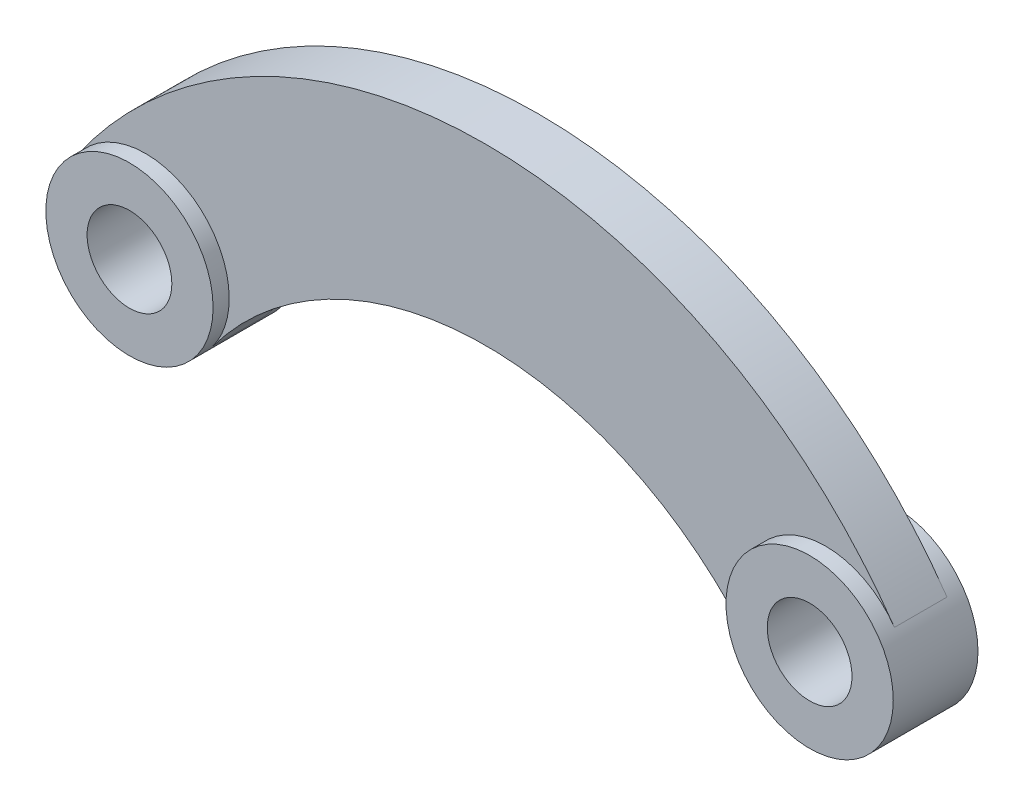
ISO-10303-21;
HEADER;
FILE_DESCRIPTION(('STEP AP214'),'2;1');
FILE_NAME('part.step','',(''),(''),'','','');
FILE_SCHEMA(('AUTOMOTIVE_DESIGN { 1 0 10303 214 1 1 1 1 }'));
ENDSEC;
DATA;
#1=APPLICATION_CONTEXT('core data for automotive mechanical design processes');
#2=APPLICATION_PROTOCOL_DEFINITION('international standard','automotive_design',2000,#1);
#3=PRODUCT_CONTEXT('',#1,'mechanical');
#4=PRODUCT('Part','Part','',(#3));
#5=PRODUCT_RELATED_PRODUCT_CATEGORY('part','',(#4));
#6=PRODUCT_DEFINITION_FORMATION('','',#4);
#7=PRODUCT_DEFINITION_CONTEXT('part definition',#1,'design');
#8=PRODUCT_DEFINITION('design','',#6,#7);
#9=PRODUCT_DEFINITION_SHAPE('','',#8);
#10=(LENGTH_UNIT() NAMED_UNIT(*) SI_UNIT(.MILLI.,.METRE.));
#11=(NAMED_UNIT(*) PLANE_ANGLE_UNIT() SI_UNIT($,.RADIAN.));
#12=(NAMED_UNIT(*) SI_UNIT($,.STERADIAN.) SOLID_ANGLE_UNIT());
#13=UNCERTAINTY_MEASURE_WITH_UNIT(LENGTH_MEASURE(1.E-05),#10,'distance_accuracy_value','');
#14=(GEOMETRIC_REPRESENTATION_CONTEXT(3) GLOBAL_UNCERTAINTY_ASSIGNED_CONTEXT((#13)) GLOBAL_UNIT_ASSIGNED_CONTEXT((#10,
#11,#12)) REPRESENTATION_CONTEXT('',''));
#15=CARTESIAN_POINT('',(0.,0.,0.));
#16=DIRECTION('',(0.,0.,1.));
#17=DIRECTION('',(1.,0.,0.));
#18=AXIS2_PLACEMENT_3D('',#15,#16,#17);
#19=CARTESIAN_POINT('',(0.,0.,-38.));
#20=DIRECTION('',(0.,0.,1.));
#21=DIRECTION('',(1.,0.,0.));
#22=AXIS2_PLACEMENT_3D('',#19,#20,#21);
#23=CYLINDRICAL_SURFACE('',#22,75.);
#24=CARTESIAN_POINT('',(0.,0.,23.5743715230607));
#25=DIRECTION('',(0.,0.,1.));
#26=DIRECTION('',(1.,0.,0.));
#27=AXIS2_PLACEMENT_3D('',#24,#25,#26);
#28=CIRCLE('',#27,75.);
#29=CARTESIAN_POINT('',(60.1973684210527,-44.7356327235914,23.5743715230607));
#30=VERTEX_POINT('',#29);
#31=CARTESIAN_POINT('',(-61.6576819407008,42.70047139903,23.5743715230607));
#32=VERTEX_POINT('',#31);
#33=EDGE_CURVE('E101',#30,#32,#28,.T.);
#34=ORIENTED_EDGE('',*,*,#33,.T.);
#35=DIRECTION('',(0.,0.,-1.));
#36=VECTOR('',#35,1.);
#37=CARTESIAN_POINT('',(-61.6576819407008,42.70047139903,23.5743715230607));
#38=LINE('',#37,#36);
#39=CARTESIAN_POINT('',(-61.6576819407008,42.70047139903,-23.5743715230607));
#40=VERTEX_POINT('',#39);
#41=EDGE_CURVE('E107',#32,#40,#38,.T.);
#42=ORIENTED_EDGE('',*,*,#41,.T.);
#43=CARTESIAN_POINT('',(0.,0.,-23.5743715230607));
#44=DIRECTION('',(0.,0.,1.));
#45=DIRECTION('',(1.,0.,0.));
#46=AXIS2_PLACEMENT_3D('',#43,#44,#45);
#47=CIRCLE('',#46,75.);
#48=CARTESIAN_POINT('',(60.1973684210527,-44.7356327235913,-23.5743715230607));
#49=VERTEX_POINT('',#48);
#50=EDGE_CURVE('E93',#49,#40,#47,.T.);
#51=ORIENTED_EDGE('',*,*,#50,.F.);
#52=DIRECTION('',(0.,0.,-1.));
#53=VECTOR('',#52,1.);
#54=CARTESIAN_POINT('',(60.1973684210527,-44.7356327235914,23.5743715230607));
#55=LINE('',#54,#53);
#56=EDGE_CURVE('E87',#30,#49,#55,.T.);
#57=ORIENTED_EDGE('',*,*,#56,.F.);
#58=EDGE_LOOP('',(#34,#42,#51,#57));
#59=FACE_BOUND('',#58,.T.);
#60=CARTESIAN_POINT('',(0.,0.,-38.));
#61=DIRECTION('',(0.,0.,1.));
#62=DIRECTION('',(1.,0.,0.));
#63=AXIS2_PLACEMENT_3D('',#60,#61,#62);
#64=CIRCLE('',#63,75.);
#65=CARTESIAN_POINT('',(75.,0.,-38.));
#66=VERTEX_POINT('',#65);
#67=EDGE_CURVE('E11',#66,#66,#64,.T.);
#68=ORIENTED_EDGE('',*,*,#67,.T.);
#69=EDGE_LOOP('',(#68));
#70=FACE_BOUND('',#69,.T.);
#71=CARTESIAN_POINT('',(0.,0.,38.));
#72=DIRECTION('',(0.,0.,1.));
#73=DIRECTION('',(1.,0.,0.));
#74=AXIS2_PLACEMENT_3D('',#71,#72,#73);
#75=CIRCLE('',#74,75.);
#76=CARTESIAN_POINT('',(75.,0.,38.));
#77=VERTEX_POINT('',#76);
#78=EDGE_CURVE('E44',#77,#77,#75,.T.);
#79=ORIENTED_EDGE('',*,*,#78,.F.);
#80=EDGE_LOOP('',(#79));
#81=FACE_BOUND('',#80,.T.);
#82=ADVANCED_FACE('F41',(#59,#70,#81),#23,.T.);
#83=CARTESIAN_POINT('',(0.,0.,-38.));
#84=DIRECTION('',(0.,0.,1.));
#85=DIRECTION('',(1.,0.,0.));
#86=AXIS2_PLACEMENT_3D('',#83,#84,#85);
#87=PLANE('',#86);
#88=CARTESIAN_POINT('',(0.,0.,-38.));
#89=DIRECTION('',(0.,0.,1.));
#90=DIRECTION('',(1.,0.,0.));
#91=AXIS2_PLACEMENT_3D('',#88,#89,#90);
#92=CIRCLE('',#91,38.);
#93=CARTESIAN_POINT('',(38.,0.,-38.));
#94=VERTEX_POINT('',#93);
#95=EDGE_CURVE('E111',#94,#94,#92,.T.);
#96=ORIENTED_EDGE('',*,*,#95,.T.);
#97=EDGE_LOOP('',(#96));
#98=FACE_BOUND('',#97,.T.);
#99=ORIENTED_EDGE('',*,*,#67,.F.);
#100=EDGE_LOOP('',(#99));
#101=FACE_BOUND('',#100,.T.);
#102=ADVANCED_FACE('F122',(#98,#101),#87,.F.);
#103=CARTESIAN_POINT('',(0.,0.,38.));
#104=DIRECTION('',(0.,0.,1.));
#105=DIRECTION('',(1.,0.,0.));
#106=AXIS2_PLACEMENT_3D('',#103,#104,#105);
#107=PLANE('',#106);
#108=CARTESIAN_POINT('',(0.,0.,38.));
#109=DIRECTION('',(0.,0.,1.));
#110=DIRECTION('',(1.,0.,0.));
#111=AXIS2_PLACEMENT_3D('',#108,#109,#110);
#112=CIRCLE('',#111,38.);
#113=CARTESIAN_POINT('',(38.,0.,38.));
#114=VERTEX_POINT('',#113);
#115=EDGE_CURVE('E110',#114,#114,#112,.T.);
#116=ORIENTED_EDGE('',*,*,#115,.F.);
#117=EDGE_LOOP('',(#116));
#118=FACE_BOUND('',#117,.T.);
#119=ORIENTED_EDGE('',*,*,#78,.T.);
#120=EDGE_LOOP('',(#119));
#121=FACE_BOUND('',#120,.T.);
#122=ADVANCED_FACE('F119',(#118,#121),#107,.T.);
#123=CARTESIAN_POINT('',(0.,0.,-38.));
#124=DIRECTION('',(0.,0.,1.));
#125=DIRECTION('',(1.,0.,0.));
#126=AXIS2_PLACEMENT_3D('',#123,#124,#125);
#127=CYLINDRICAL_SURFACE('',#126,38.);
#128=ORIENTED_EDGE('',*,*,#95,.F.);
#129=EDGE_LOOP('',(#128));
#130=FACE_BOUND('',#129,.T.);
#131=ORIENTED_EDGE('',*,*,#115,.T.);
#132=EDGE_LOOP('',(#131));
#133=FACE_BOUND('',#132,.T.);
#134=ADVANCED_FACE('F117',(#130,#133),#127,.F.);
#135=CARTESIAN_POINT('',(305.,-211.224998520535,23.5743715230607));
#136=DIRECTION('',(0.,0.,-1.));
#137=DIRECTION('',(-1.,0.,0.));
#138=AXIS2_PLACEMENT_3D('',#135,#136,#137);
#139=CYLINDRICAL_SURFACE('',#138,446.);
#140=CARTESIAN_POINT('',(305.,-211.224998520535,-23.5743715230607));
#141=DIRECTION('',(0.,0.,1.));
#142=DIRECTION('',(1.,0.,0.));
#143=AXIS2_PLACEMENT_3D('',#140,#141,#142);
#144=CIRCLE('',#143,446.);
#145=CARTESIAN_POINT('',(671.657681940701,42.70047139903,-23.5743715230607));
#146=VERTEX_POINT('',#145);
#147=EDGE_CURVE('E97',#40,#146,#144,.F.);
#148=ORIENTED_EDGE('',*,*,#147,.F.);
#149=ORIENTED_EDGE('',*,*,#41,.F.);
#150=CARTESIAN_POINT('',(305.,-211.224998520535,23.5743715230607));
#151=DIRECTION('',(0.,0.,1.));
#152=DIRECTION('',(1.,0.,0.));
#153=AXIS2_PLACEMENT_3D('',#150,#151,#152);
#154=CIRCLE('',#153,446.);
#155=CARTESIAN_POINT('',(671.657681940701,42.7004713990299,23.5743715230607));
#156=VERTEX_POINT('',#155);
#157=EDGE_CURVE('E98',#32,#156,#154,.F.);
#158=ORIENTED_EDGE('',*,*,#157,.T.);
#159=DIRECTION('',(0.,0.,-1.));
#160=VECTOR('',#159,1.);
#161=CARTESIAN_POINT('',(671.657681940701,42.7004713990299,23.5743715230607));
#162=LINE('',#161,#160);
#163=EDGE_CURVE('E88',#156,#146,#162,.T.);
#164=ORIENTED_EDGE('',*,*,#163,.T.);
#165=EDGE_LOOP('',(#148,#149,#158,#164));
#166=FACE_BOUND('',#165,.T.);
#167=ADVANCED_FACE('F187',(#166),#139,.T.);
#168=CARTESIAN_POINT('',(305.,-226.660539132863,23.5743715230607));
#169=DIRECTION('',(0.,0.,-1.));
#170=DIRECTION('',(-1.,0.,0.));
#171=AXIS2_PLACEMENT_3D('',#168,#169,#170);
#172=CYLINDRICAL_SURFACE('',#171,305.);
#173=CARTESIAN_POINT('',(305.,-226.660539132863,-23.5743715230607));
#174=DIRECTION('',(0.,0.,1.));
#175=DIRECTION('',(1.,0.,0.));
#176=AXIS2_PLACEMENT_3D('',#173,#174,#175);
#177=CIRCLE('',#176,305.);
#178=CARTESIAN_POINT('',(549.802631578948,-44.7356327235913,-23.5743715230607));
#179=VERTEX_POINT('',#178);
#180=EDGE_CURVE('E55',#49,#179,#177,.F.);
#181=ORIENTED_EDGE('',*,*,#180,.T.);
#182=DIRECTION('',(0.,0.,-1.));
#183=VECTOR('',#182,1.);
#184=CARTESIAN_POINT('',(549.802631578948,-44.7356327235913,23.5743715230607));
#185=LINE('',#184,#183);
#186=CARTESIAN_POINT('',(549.802631578947,-44.7356327235913,23.5743715230607));
#187=VERTEX_POINT('',#186);
#188=EDGE_CURVE('E77',#187,#179,#185,.T.);
#189=ORIENTED_EDGE('',*,*,#188,.F.);
#190=CARTESIAN_POINT('',(305.,-226.660539132863,23.5743715230607));
#191=DIRECTION('',(0.,0.,1.));
#192=DIRECTION('',(1.,0.,0.));
#193=AXIS2_PLACEMENT_3D('',#190,#191,#192);
#194=CIRCLE('',#193,305.);
#195=EDGE_CURVE('E63',#30,#187,#194,.F.);
#196=ORIENTED_EDGE('',*,*,#195,.F.);
#197=ORIENTED_EDGE('',*,*,#56,.T.);
#198=EDGE_LOOP('',(#181,#189,#196,#197));
#199=FACE_BOUND('',#198,.T.);
#200=ADVANCED_FACE('F90',(#199),#172,.F.);
#201=CARTESIAN_POINT('',(0.,0.,23.5743715230607));
#202=DIRECTION('',(0.,0.,1.));
#203=DIRECTION('',(1.,0.,0.));
#204=AXIS2_PLACEMENT_3D('',#201,#202,#203);
#205=PLANE('',#204);
#206=ORIENTED_EDGE('',*,*,#157,.F.);
#207=ORIENTED_EDGE('',*,*,#33,.F.);
#208=ORIENTED_EDGE('',*,*,#195,.T.);
#209=CARTESIAN_POINT('',(610.,0.,23.5743715230607));
#210=DIRECTION('',(0.,0.,1.));
#211=DIRECTION('',(1.,0.,0.));
#212=AXIS2_PLACEMENT_3D('',#209,#210,#211);
#213=CIRCLE('',#212,74.9999999999999);
#214=EDGE_CURVE('E86',#156,#187,#213,.T.);
#215=ORIENTED_EDGE('',*,*,#214,.F.);
#216=EDGE_LOOP('',(#206,#207,#208,#215));
#217=FACE_BOUND('',#216,.T.);
#218=ADVANCED_FACE('F180',(#217),#205,.T.);
#219=CARTESIAN_POINT('',(0.,0.,-23.5743715230607));
#220=DIRECTION('',(0.,0.,1.));
#221=DIRECTION('',(1.,0.,0.));
#222=AXIS2_PLACEMENT_3D('',#219,#220,#221);
#223=PLANE('',#222);
#224=ORIENTED_EDGE('',*,*,#147,.T.);
#225=CARTESIAN_POINT('',(610.,0.,-23.5743715230607));
#226=DIRECTION('',(0.,0.,1.));
#227=DIRECTION('',(1.,0.,0.));
#228=AXIS2_PLACEMENT_3D('',#225,#226,#227);
#229=CIRCLE('',#228,74.9999999999999);
#230=EDGE_CURVE('E82',#146,#179,#229,.T.);
#231=ORIENTED_EDGE('',*,*,#230,.T.);
#232=ORIENTED_EDGE('',*,*,#180,.F.);
#233=ORIENTED_EDGE('',*,*,#50,.T.);
#234=EDGE_LOOP('',(#224,#231,#232,#233));
#235=FACE_BOUND('',#234,.T.);
#236=ADVANCED_FACE('F96',(#235),#223,.F.);
#237=CARTESIAN_POINT('',(610.,0.,-38.));
#238=DIRECTION('',(0.,0.,1.));
#239=DIRECTION('',(1.,0.,0.));
#240=AXIS2_PLACEMENT_3D('',#237,#238,#239);
#241=CYLINDRICAL_SURFACE('',#240,74.9999999999999);
#242=ORIENTED_EDGE('',*,*,#163,.F.);
#243=ORIENTED_EDGE('',*,*,#214,.T.);
#244=ORIENTED_EDGE('',*,*,#188,.T.);
#245=ORIENTED_EDGE('',*,*,#230,.F.);
#246=EDGE_LOOP('',(#242,#243,#244,#245));
#247=FACE_BOUND('',#246,.T.);
#248=CARTESIAN_POINT('',(610.,0.,-38.));
#249=DIRECTION('',(0.,0.,1.));
#250=DIRECTION('',(1.,0.,0.));
#251=AXIS2_PLACEMENT_3D('',#248,#249,#250);
#252=CIRCLE('',#251,74.9999999999999);
#253=CARTESIAN_POINT('',(685.,0.,-38.));
#254=VERTEX_POINT('',#253);
#255=EDGE_CURVE('E144',#254,#254,#252,.T.);
#256=ORIENTED_EDGE('',*,*,#255,.T.);
#257=EDGE_LOOP('',(#256));
#258=FACE_BOUND('',#257,.T.);
#259=CARTESIAN_POINT('',(610.,0.,38.));
#260=DIRECTION('',(0.,0.,1.));
#261=DIRECTION('',(1.,0.,0.));
#262=AXIS2_PLACEMENT_3D('',#259,#260,#261);
#263=CIRCLE('',#262,74.9999999999999);
#264=CARTESIAN_POINT('',(685.,0.,38.));
#265=VERTEX_POINT('',#264);
#266=EDGE_CURVE('E146',#265,#265,#263,.T.);
#267=ORIENTED_EDGE('',*,*,#266,.F.);
#268=EDGE_LOOP('',(#267));
#269=FACE_BOUND('',#268,.T.);
#270=ADVANCED_FACE('F79',(#247,#258,#269),#241,.T.);
#271=CARTESIAN_POINT('',(610.,0.,-38.));
#272=DIRECTION('',(0.,0.,1.));
#273=DIRECTION('',(1.,0.,0.));
#274=AXIS2_PLACEMENT_3D('',#271,#272,#273);
#275=PLANE('',#274);
#276=CARTESIAN_POINT('',(610.,0.,-38.));
#277=DIRECTION('',(0.,0.,1.));
#278=DIRECTION('',(1.,0.,0.));
#279=AXIS2_PLACEMENT_3D('',#276,#277,#278);
#280=CIRCLE('',#279,38.);
#281=CARTESIAN_POINT('',(648.,0.,-38.));
#282=VERTEX_POINT('',#281);
#283=EDGE_CURVE('E150',#282,#282,#280,.T.);
#284=ORIENTED_EDGE('',*,*,#283,.T.);
#285=EDGE_LOOP('',(#284));
#286=FACE_BOUND('',#285,.T.);
#287=ORIENTED_EDGE('',*,*,#255,.F.);
#288=EDGE_LOOP('',(#287));
#289=FACE_BOUND('',#288,.T.);
#290=ADVANCED_FACE('F158',(#286,#289),#275,.F.);
#291=CARTESIAN_POINT('',(610.,0.,38.));
#292=DIRECTION('',(0.,0.,1.));
#293=DIRECTION('',(1.,0.,0.));
#294=AXIS2_PLACEMENT_3D('',#291,#292,#293);
#295=PLANE('',#294);
#296=CARTESIAN_POINT('',(610.,0.,38.));
#297=DIRECTION('',(0.,0.,1.));
#298=DIRECTION('',(1.,0.,0.));
#299=AXIS2_PLACEMENT_3D('',#296,#297,#298);
#300=CIRCLE('',#299,38.);
#301=CARTESIAN_POINT('',(648.,0.,38.));
#302=VERTEX_POINT('',#301);
#303=EDGE_CURVE('E152',#302,#302,#300,.T.);
#304=ORIENTED_EDGE('',*,*,#303,.F.);
#305=EDGE_LOOP('',(#304));
#306=FACE_BOUND('',#305,.T.);
#307=ORIENTED_EDGE('',*,*,#266,.T.);
#308=EDGE_LOOP('',(#307));
#309=FACE_BOUND('',#308,.T.);
#310=ADVANCED_FACE('F164',(#306,#309),#295,.T.);
#311=CARTESIAN_POINT('',(610.,0.,-38.));
#312=DIRECTION('',(0.,0.,1.));
#313=DIRECTION('',(1.,0.,0.));
#314=AXIS2_PLACEMENT_3D('',#311,#312,#313);
#315=CYLINDRICAL_SURFACE('',#314,38.);
#316=ORIENTED_EDGE('',*,*,#283,.F.);
#317=EDGE_LOOP('',(#316));
#318=FACE_BOUND('',#317,.T.);
#319=ORIENTED_EDGE('',*,*,#303,.T.);
#320=EDGE_LOOP('',(#319));
#321=FACE_BOUND('',#320,.T.);
#322=ADVANCED_FACE('F161',(#318,#321),#315,.F.);
#323=CLOSED_SHELL('',(#82,#102,#122,#134,#167,#200,#218,#236,#270,#290,#310,#322));
#324=MANIFOLD_SOLID_BREP('B2',#323);
#325=ADVANCED_BREP_SHAPE_REPRESENTATION('',(#18,#324),#14);
#326=SHAPE_DEFINITION_REPRESENTATION(#9,#325);
ENDSEC;
END-ISO-10303-21;
